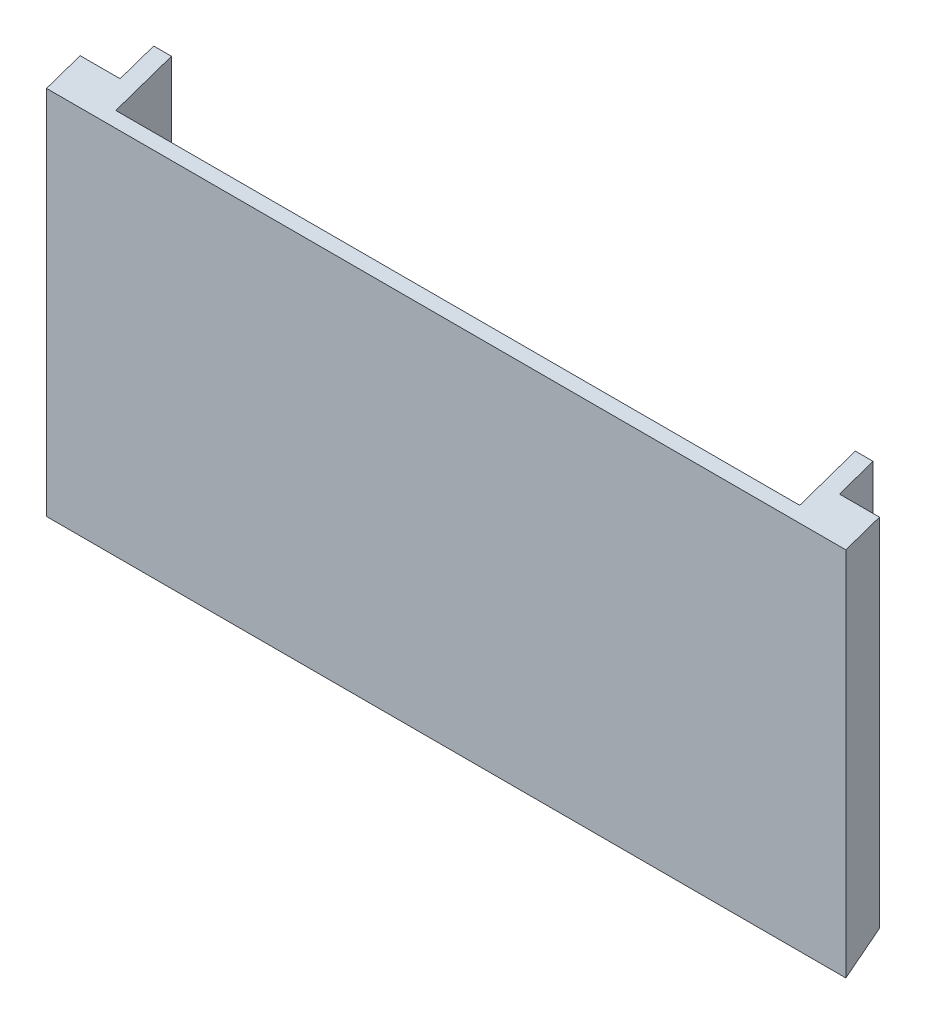
ISO-10303-21;
HEADER;
FILE_DESCRIPTION(('STEP AP214'),'2;1');
FILE_NAME('part.step','',(''),(''),'','','');
FILE_SCHEMA(('AUTOMOTIVE_DESIGN { 1 0 10303 214 1 1 1 1 }'));
ENDSEC;
DATA;
#1=APPLICATION_CONTEXT('core data for automotive mechanical design processes');
#2=APPLICATION_PROTOCOL_DEFINITION('international standard','automotive_design',2000,#1);
#3=PRODUCT_CONTEXT('',#1,'mechanical');
#4=PRODUCT('Part','Part','',(#3));
#5=PRODUCT_RELATED_PRODUCT_CATEGORY('part','',(#4));
#6=PRODUCT_DEFINITION_FORMATION('','',#4);
#7=PRODUCT_DEFINITION_CONTEXT('part definition',#1,'design');
#8=PRODUCT_DEFINITION('design','',#6,#7);
#9=PRODUCT_DEFINITION_SHAPE('','',#8);
#10=(LENGTH_UNIT() NAMED_UNIT(*) SI_UNIT(.MILLI.,.METRE.));
#11=(NAMED_UNIT(*) PLANE_ANGLE_UNIT() SI_UNIT($,.RADIAN.));
#12=(NAMED_UNIT(*) SI_UNIT($,.STERADIAN.) SOLID_ANGLE_UNIT());
#13=UNCERTAINTY_MEASURE_WITH_UNIT(LENGTH_MEASURE(1.E-05),#10,'distance_accuracy_value','');
#14=(GEOMETRIC_REPRESENTATION_CONTEXT(3) GLOBAL_UNCERTAINTY_ASSIGNED_CONTEXT((#13)) GLOBAL_UNIT_ASSIGNED_CONTEXT((#10,
#11,#12)) REPRESENTATION_CONTEXT('',''));
#15=CARTESIAN_POINT('',(0.,0.,0.));
#16=DIRECTION('',(0.,0.,1.));
#17=DIRECTION('',(1.,0.,0.));
#18=AXIS2_PLACEMENT_3D('',#15,#16,#17);
#19=CARTESIAN_POINT('',(39.1808763165733,-23.6571047674019,-8.));
#20=DIRECTION('',(-1.,0.,0.));
#21=DIRECTION('',(0.,0.,1.));
#22=AXIS2_PLACEMENT_3D('',#19,#20,#21);
#23=PLANE('',#22);
#24=DIRECTION('',(0.,-1.,0.));
#25=VECTOR('',#24,1.);
#26=CARTESIAN_POINT('',(39.1808763165733,-23.6571047674019,-8.));
#27=LINE('',#26,#25);
#28=CARTESIAN_POINT('',(39.1808763165733,-26.6571047674019,-8.));
#29=VERTEX_POINT('',#28);
#30=CARTESIAN_POINT('',(39.1808763165733,-36.7657297001133,-8.));
#31=VERTEX_POINT('',#30);
#32=EDGE_CURVE('E239',#29,#31,#27,.T.);
#33=ORIENTED_EDGE('',*,*,#32,.T.);
#34=CARTESIAN_POINT('',(39.1808763165733,-36.7657297001133,-5.));
#35=DIRECTION('',(-1.,0.,0.));
#36=DIRECTION('',(0.,0.,1.));
#37=AXIS2_PLACEMENT_3D('',#34,#35,#36);
#38=CIRCLE('',#37,3.);
#39=CARTESIAN_POINT('',(39.1808763165733,-39.7657297001133,-5.));
#40=VERTEX_POINT('',#39);
#41=EDGE_CURVE('E365',#31,#40,#38,.T.);
#42=ORIENTED_EDGE('',*,*,#41,.T.);
#43=DIRECTION('',(0.,0.,1.));
#44=VECTOR('',#43,1.);
#45=CARTESIAN_POINT('',(39.1808763165733,-39.7657297001133,-8.));
#46=LINE('',#45,#44);
#47=CARTESIAN_POINT('',(39.1808763165733,-39.7657297001133,0.));
#48=VERTEX_POINT('',#47);
#49=EDGE_CURVE('E262',#40,#48,#46,.T.);
#50=ORIENTED_EDGE('',*,*,#49,.T.);
#51=DIRECTION('',(0.,-1.,0.));
#52=VECTOR('',#51,1.);
#53=CARTESIAN_POINT('',(39.1808763165733,-23.6571047674019,0.));
#54=LINE('',#53,#52);
#55=CARTESIAN_POINT('',(39.1808763165733,-23.6571047674019,0.));
#56=VERTEX_POINT('',#55);
#57=EDGE_CURVE('E249',#56,#48,#54,.T.);
#58=ORIENTED_EDGE('',*,*,#57,.F.);
#59=DIRECTION('',(0.,0.,1.));
#60=VECTOR('',#59,1.);
#61=CARTESIAN_POINT('',(39.1808763165733,-23.6571047674019,-8.));
#62=LINE('',#61,#60);
#63=CARTESIAN_POINT('',(39.1808763165733,-23.6571047674019,-5.));
#64=VERTEX_POINT('',#63);
#65=EDGE_CURVE('E260',#64,#56,#62,.T.);
#66=ORIENTED_EDGE('',*,*,#65,.F.);
#67=CARTESIAN_POINT('',(39.1808763165733,-26.6571047674019,-5.));
#68=DIRECTION('',(-1.,0.,0.));
#69=DIRECTION('',(0.,0.,1.));
#70=AXIS2_PLACEMENT_3D('',#67,#68,#69);
#71=CIRCLE('',#70,3.);
#72=EDGE_CURVE('E363',#64,#29,#71,.T.);
#73=ORIENTED_EDGE('',*,*,#72,.T.);
#74=EDGE_LOOP('',(#33,#42,#50,#58,#66,#73));
#75=FACE_BOUND('',#74,.T.);
#76=DIRECTION('',(0.,-1.,0.));
#77=VECTOR('',#76,1.);
#78=CARTESIAN_POINT('',(39.1808763165733,-23.6571047674019,-5.9));
#79=LINE('',#78,#77);
#80=CARTESIAN_POINT('',(39.1808763165733,-26.6571047674019,-5.9));
#81=VERTEX_POINT('',#80);
#82=CARTESIAN_POINT('',(39.1808763165733,-36.7657297001133,-5.9));
#83=VERTEX_POINT('',#82);
#84=EDGE_CURVE('E236',#81,#83,#79,.T.);
#85=ORIENTED_EDGE('',*,*,#84,.F.);
#86=CARTESIAN_POINT('',(39.1808763165733,-26.6571047674019,-4.));
#87=DIRECTION('',(-1.,0.,0.));
#88=DIRECTION('',(0.,0.,1.));
#89=AXIS2_PLACEMENT_3D('',#86,#87,#88);
#90=CIRCLE('',#89,1.9);
#91=CARTESIAN_POINT('',(39.1808763165733,-26.6571047674019,-2.1));
#92=VERTEX_POINT('',#91);
#93=EDGE_CURVE('E229',#81,#92,#90,.F.);
#94=ORIENTED_EDGE('',*,*,#93,.T.);
#95=DIRECTION('',(0.,-1.,0.));
#96=VECTOR('',#95,1.);
#97=CARTESIAN_POINT('',(39.1808763165733,-23.6571047674019,-2.1));
#98=LINE('',#97,#96);
#99=CARTESIAN_POINT('',(39.1808763165733,-36.7657297001133,-2.1));
#100=VERTEX_POINT('',#99);
#101=EDGE_CURVE('E205',#92,#100,#98,.T.);
#102=ORIENTED_EDGE('',*,*,#101,.T.);
#103=CARTESIAN_POINT('',(39.1808763165733,-36.7657297001133,-4.));
#104=DIRECTION('',(-1.,0.,0.));
#105=DIRECTION('',(0.,0.,1.));
#106=AXIS2_PLACEMENT_3D('',#103,#104,#105);
#107=CIRCLE('',#106,1.9);
#108=EDGE_CURVE('E234',#83,#100,#107,.T.);
#109=ORIENTED_EDGE('',*,*,#108,.F.);
#110=EDGE_LOOP('',(#85,#94,#102,#109));
#111=FACE_BOUND('',#110,.T.);
#112=ADVANCED_FACE('F40',(#75,#111),#23,.T.);
#113=CARTESIAN_POINT('',(50.6808763165733,-23.6571047674019,-8.));
#114=DIRECTION('',(-1.,0.,0.));
#115=DIRECTION('',(0.,0.,1.));
#116=AXIS2_PLACEMENT_3D('',#113,#114,#115);
#117=PLANE('',#116);
#118=DIRECTION('',(0.,0.,1.));
#119=VECTOR('',#118,1.);
#120=CARTESIAN_POINT('',(50.6808763165733,-39.7657297001133,-8.));
#121=LINE('',#120,#119);
#122=CARTESIAN_POINT('',(50.6808763165733,-39.7657297001133,-5.));
#123=VERTEX_POINT('',#122);
#124=CARTESIAN_POINT('',(50.6808763165733,-39.7657297001133,0.));
#125=VERTEX_POINT('',#124);
#126=EDGE_CURVE('E246',#123,#125,#121,.T.);
#127=ORIENTED_EDGE('',*,*,#126,.F.);
#128=CARTESIAN_POINT('',(50.6808763165733,-36.7657297001133,-5.));
#129=DIRECTION('',(-1.,0.,0.));
#130=DIRECTION('',(0.,0.,1.));
#131=AXIS2_PLACEMENT_3D('',#128,#129,#130);
#132=CIRCLE('',#131,3.);
#133=CARTESIAN_POINT('',(50.6808763165733,-36.7657297001133,-8.));
#134=VERTEX_POINT('',#133);
#135=EDGE_CURVE('E369',#123,#134,#132,.F.);
#136=ORIENTED_EDGE('',*,*,#135,.T.);
#137=DIRECTION('',(0.,-1.,0.));
#138=VECTOR('',#137,1.);
#139=CARTESIAN_POINT('',(50.6808763165733,-23.6571047674019,-8.));
#140=LINE('',#139,#138);
#141=CARTESIAN_POINT('',(50.6808763165733,-26.6571047674019,-8.));
#142=VERTEX_POINT('',#141);
#143=EDGE_CURVE('E242',#142,#134,#140,.T.);
#144=ORIENTED_EDGE('',*,*,#143,.F.);
#145=CARTESIAN_POINT('',(50.6808763165733,-26.6571047674019,-5.));
#146=DIRECTION('',(-1.,0.,0.));
#147=DIRECTION('',(0.,0.,1.));
#148=AXIS2_PLACEMENT_3D('',#145,#146,#147);
#149=CIRCLE('',#148,3.);
#150=CARTESIAN_POINT('',(50.6808763165733,-23.6571047674019,-5.));
#151=VERTEX_POINT('',#150);
#152=EDGE_CURVE('E55',#142,#151,#149,.F.);
#153=ORIENTED_EDGE('',*,*,#152,.T.);
#154=DIRECTION('',(0.,0.,1.));
#155=VECTOR('',#154,1.);
#156=CARTESIAN_POINT('',(50.6808763165733,-23.6571047674019,-8.));
#157=LINE('',#156,#155);
#158=CARTESIAN_POINT('',(50.6808763165733,-23.6571047674019,0.));
#159=VERTEX_POINT('',#158);
#160=EDGE_CURVE('E258',#151,#159,#157,.T.);
#161=ORIENTED_EDGE('',*,*,#160,.T.);
#162=DIRECTION('',(0.,-1.,0.));
#163=VECTOR('',#162,1.);
#164=CARTESIAN_POINT('',(50.6808763165733,-23.6571047674019,0.));
#165=LINE('',#164,#163);
#166=EDGE_CURVE('E243',#159,#125,#165,.T.);
#167=ORIENTED_EDGE('',*,*,#166,.T.);
#168=EDGE_LOOP('',(#127,#136,#144,#153,#161,#167));
#169=FACE_BOUND('',#168,.T.);
#170=CARTESIAN_POINT('',(50.6808763165733,-26.6571047674019,-4.));
#171=DIRECTION('',(1.,0.,0.));
#172=DIRECTION('',(0.,0.,-1.));
#173=AXIS2_PLACEMENT_3D('',#170,#171,#172);
#174=CIRCLE('',#173,1.9);
#175=CARTESIAN_POINT('',(50.6808763165733,-26.6571047674019,-2.1));
#176=VERTEX_POINT('',#175);
#177=CARTESIAN_POINT('',(50.6808763165733,-26.6571047674019,-5.9));
#178=VERTEX_POINT('',#177);
#179=EDGE_CURVE('E213',#176,#178,#174,.F.);
#180=ORIENTED_EDGE('',*,*,#179,.T.);
#181=DIRECTION('',(0.,1.,0.));
#182=VECTOR('',#181,1.);
#183=CARTESIAN_POINT('',(50.6808763165733,0.,-5.9));
#184=LINE('',#183,#182);
#185=CARTESIAN_POINT('',(50.6808763165733,-36.7657297001133,-5.9));
#186=VERTEX_POINT('',#185);
#187=EDGE_CURVE('E218',#186,#178,#184,.T.);
#188=ORIENTED_EDGE('',*,*,#187,.F.);
#189=CARTESIAN_POINT('',(50.6808763165733,-36.7657297001133,-4.));
#190=DIRECTION('',(1.,0.,0.));
#191=DIRECTION('',(0.,0.,-1.));
#192=AXIS2_PLACEMENT_3D('',#189,#190,#191);
#193=CIRCLE('',#192,1.9);
#194=CARTESIAN_POINT('',(50.6808763165733,-36.7657297001133,-2.1));
#195=VERTEX_POINT('',#194);
#196=EDGE_CURVE('E222',#195,#186,#193,.T.);
#197=ORIENTED_EDGE('',*,*,#196,.F.);
#198=DIRECTION('',(0.,1.,0.));
#199=VECTOR('',#198,1.);
#200=CARTESIAN_POINT('',(50.6808763165733,0.,-2.09999999999999));
#201=LINE('',#200,#199);
#202=EDGE_CURVE('E202',#195,#176,#201,.T.);
#203=ORIENTED_EDGE('',*,*,#202,.T.);
#204=EDGE_LOOP('',(#180,#188,#197,#203));
#205=FACE_BOUND('',#204,.T.);
#206=ADVANCED_FACE('F220',(#169,#205),#117,.F.);
#207=CARTESIAN_POINT('',(0.,0.,0.));
#208=DIRECTION('',(0.,0.,1.));
#209=DIRECTION('',(1.,0.,0.));
#210=AXIS2_PLACEMENT_3D('',#207,#208,#209);
#211=PLANE('',#210);
#212=CARTESIAN_POINT('',(75.2338567398915,-15.8072520624966,0.));
#213=DIRECTION('',(0.,0.,1.));
#214=DIRECTION('',(1.,0.,0.));
#215=AXIS2_PLACEMENT_3D('',#212,#213,#214);
#216=CIRCLE('',#215,3.00000000000001);
#217=CARTESIAN_POINT('',(78.2338567398915,-15.8072520624966,0.));
#218=VERTEX_POINT('',#217);
#219=EDGE_CURVE('E11',#218,#218,#216,.F.);
#220=ORIENTED_EDGE('',*,*,#219,.F.);
#221=EDGE_LOOP('',(#220));
#222=FACE_BOUND('',#221,.T.);
#223=CARTESIAN_POINT('',(93.0738567398915,-15.8072520624966,0.));
#224=DIRECTION('',(0.,0.,1.));
#225=DIRECTION('',(1.,0.,0.));
#226=AXIS2_PLACEMENT_3D('',#223,#224,#225);
#227=CIRCLE('',#226,3.00000000000001);
#228=CARTESIAN_POINT('',(96.0738567398915,-15.8072520624966,0.));
#229=VERTEX_POINT('',#228);
#230=EDGE_CURVE('E48',#229,#229,#227,.F.);
#231=ORIENTED_EDGE('',*,*,#230,.F.);
#232=EDGE_LOOP('',(#231));
#233=FACE_BOUND('',#232,.T.);
#234=CARTESIAN_POINT('',(84.0638567398915,-47.6972520624967,0.));
#235=DIRECTION('',(0.,0.,1.));
#236=DIRECTION('',(1.,0.,0.));
#237=AXIS2_PLACEMENT_3D('',#234,#235,#236);
#238=CIRCLE('',#237,2.);
#239=CARTESIAN_POINT('',(86.0638567398915,-47.6972520624967,0.));
#240=VERTEX_POINT('',#239);
#241=EDGE_CURVE('E374',#240,#240,#238,.F.);
#242=ORIENTED_EDGE('',*,*,#241,.F.);
#243=EDGE_LOOP('',(#242));
#244=FACE_BOUND('',#243,.T.);
#245=DIRECTION('',(0.,1.,0.));
#246=VECTOR('',#245,1.);
#247=CARTESIAN_POINT('',(-12.533463782237,0.,0.));
#248=LINE('',#247,#246);
#249=CARTESIAN_POINT('',(-12.533463782237,-62.219139279103,0.));
#250=VERTEX_POINT('',#249);
#251=CARTESIAN_POINT('',(-12.533463782237,-7.06419972794608,0.));
#252=VERTEX_POINT('',#251);
#253=EDGE_CURVE('E305',#250,#252,#248,.T.);
#254=ORIENTED_EDGE('',*,*,#253,.T.);
#255=DIRECTION('',(1.,0.,0.));
#256=VECTOR('',#255,1.);
#257=CARTESIAN_POINT('',(0.,-7.06419972794608,0.));
#258=LINE('',#257,#256);
#259=CARTESIAN_POINT('',(102.966536217763,-7.06419972794608,0.));
#260=VERTEX_POINT('',#259);
#261=EDGE_CURVE('E351',#252,#260,#258,.T.);
#262=ORIENTED_EDGE('',*,*,#261,.T.);
#263=DIRECTION('',(0.,-1.,0.));
#264=VECTOR('',#263,1.);
#265=CARTESIAN_POINT('',(102.966536217763,0.,0.));
#266=LINE('',#265,#264);
#267=CARTESIAN_POINT('',(102.966536217763,-62.219139279103,0.));
#268=VERTEX_POINT('',#267);
#269=EDGE_CURVE('E308',#260,#268,#266,.T.);
#270=ORIENTED_EDGE('',*,*,#269,.T.);
#271=DIRECTION('',(1.,0.,0.));
#272=VECTOR('',#271,1.);
#273=CARTESIAN_POINT('',(0.,-62.219139279103,0.));
#274=LINE('',#273,#272);
#275=EDGE_CURVE('E269',#250,#268,#274,.T.);
#276=ORIENTED_EDGE('',*,*,#275,.F.);
#277=EDGE_LOOP('',(#254,#262,#270,#276));
#278=FACE_BOUND('',#277,.T.);
#279=DIRECTION('',(-1.,0.,0.));
#280=VECTOR('',#279,1.);
#281=CARTESIAN_POINT('',(50.6808763165733,-39.7657297001133,0.));
#282=LINE('',#281,#280);
#283=EDGE_CURVE('E238',#125,#48,#282,.T.);
#284=ORIENTED_EDGE('',*,*,#283,.F.);
#285=ORIENTED_EDGE('',*,*,#166,.F.);
#286=DIRECTION('',(-1.,0.,0.));
#287=VECTOR('',#286,1.);
#288=CARTESIAN_POINT('',(50.6808763165733,-23.6571047674019,0.));
#289=LINE('',#288,#287);
#290=EDGE_CURVE('E252',#159,#56,#289,.T.);
#291=ORIENTED_EDGE('',*,*,#290,.T.);
#292=ORIENTED_EDGE('',*,*,#57,.T.);
#293=EDGE_LOOP('',(#284,#285,#291,#292));
#294=FACE_BOUND('',#293,.T.);
#295=ADVANCED_FACE('F381',(#222,#233,#244,#278,#294),#211,.F.);
#296=DIRECTION('',(1.,0.,0.));
#297=VECTOR('',#296,1.);
#298=CARTESIAN_POINT('',(0.,-62.219139279103,0.));
#299=LINE('',#298,#297);
#300=CARTESIAN_POINT('',(-22.2834637822371,-62.219139279103,0.));
#301=VERTEX_POINT('',#300);
#302=CARTESIAN_POINT('',(-15.533463782237,-62.219139279103,0.));
#303=VERTEX_POINT('',#302);
#304=EDGE_CURVE('E272',#301,#303,#299,.T.);
#305=ORIENTED_EDGE('',*,*,#304,.F.);
#306=DIRECTION('',(0.,-1.,0.));
#307=VECTOR('',#306,1.);
#308=CARTESIAN_POINT('',(-22.2834637822371,-2.06419972794604,0.));
#309=LINE('',#308,#307);
#310=CARTESIAN_POINT('',(-22.2834637822371,-2.06419972794604,0.));
#311=VERTEX_POINT('',#310);
#312=EDGE_CURVE('E321',#311,#301,#309,.T.);
#313=ORIENTED_EDGE('',*,*,#312,.F.);
#314=DIRECTION('',(-1.,0.,0.));
#315=VECTOR('',#314,1.);
#316=CARTESIAN_POINT('',(-12.2834637822371,-2.06419972794605,0.));
#317=LINE('',#316,#315);
#318=CARTESIAN_POINT('',(-15.533463782237,-2.06419972794605,0.));
#319=VERTEX_POINT('',#318);
#320=EDGE_CURVE('E336',#319,#311,#317,.T.);
#321=ORIENTED_EDGE('',*,*,#320,.F.);
#322=DIRECTION('',(0.,1.,0.));
#323=VECTOR('',#322,1.);
#324=CARTESIAN_POINT('',(-15.533463782237,0.,0.));
#325=LINE('',#324,#323);
#326=EDGE_CURVE('E303',#303,#319,#325,.T.);
#327=ORIENTED_EDGE('',*,*,#326,.F.);
#328=EDGE_LOOP('',(#305,#313,#321,#327));
#329=FACE_BOUND('',#328,.T.);
#330=ADVANCED_FACE('F384',(#329),#211,.F.);
#331=CARTESIAN_POINT('',(105.966536217763,-62.219139279103,0.));
#332=VERTEX_POINT('',#331);
#333=CARTESIAN_POINT('',(112.716536217763,-62.219139279103,0.));
#334=VERTEX_POINT('',#333);
#335=EDGE_CURVE('E275',#332,#334,#299,.T.);
#336=ORIENTED_EDGE('',*,*,#335,.F.);
#337=DIRECTION('',(0.,-1.,0.));
#338=VECTOR('',#337,1.);
#339=CARTESIAN_POINT('',(105.966536217763,0.,0.));
#340=LINE('',#339,#338);
#341=CARTESIAN_POINT('',(105.966536217763,-2.06419972794605,0.));
#342=VERTEX_POINT('',#341);
#343=EDGE_CURVE('E290',#342,#332,#340,.T.);
#344=ORIENTED_EDGE('',*,*,#343,.F.);
#345=CARTESIAN_POINT('',(112.716536217763,-2.06419972794605,0.));
#346=VERTEX_POINT('',#345);
#347=EDGE_CURVE('E326',#346,#342,#317,.T.);
#348=ORIENTED_EDGE('',*,*,#347,.F.);
#349=DIRECTION('',(0.,1.,0.));
#350=VECTOR('',#349,1.);
#351=CARTESIAN_POINT('',(112.716536217763,-2.06419972794605,0.));
#352=LINE('',#351,#350);
#353=EDGE_CURVE('E334',#334,#346,#352,.T.);
#354=ORIENTED_EDGE('',*,*,#353,.F.);
#355=EDGE_LOOP('',(#336,#344,#348,#354));
#356=FACE_BOUND('',#355,.T.);
#357=ADVANCED_FACE('F387',(#356),#211,.F.);
#358=CARTESIAN_POINT('',(-22.2834637822371,-4.01457446258598,5.67415530228758));
#359=DIRECTION('',(1.,0.,0.));
#360=DIRECTION('',(0.,0.,-1.));
#361=AXIS2_PLACEMENT_3D('',#358,#359,#360);
#362=PLANE('',#361);
#363=DIRECTION('',(0.,0.614135228944487,-0.789200811308062));
#364=VECTOR('',#363,1.);
#365=CARTESIAN_POINT('',(-22.2834637822371,-43.0167115946314,-24.6762777861082));
#366=LINE('',#365,#364);
#367=CARTESIAN_POINT('',(-22.2834637822371,-66.6346170836192,5.67415530228758));
#368=VERTEX_POINT('',#367);
#369=EDGE_CURVE('E278',#368,#301,#366,.T.);
#370=ORIENTED_EDGE('',*,*,#369,.F.);
#371=DIRECTION('',(0.,-1.,0.));
#372=VECTOR('',#371,1.);
#373=CARTESIAN_POINT('',(-22.2834637822371,-4.01457446258598,5.67415530228758));
#374=LINE('',#373,#372);
#375=CARTESIAN_POINT('',(-22.2834637822371,-4.01457446258598,5.67415530228758));
#376=VERTEX_POINT('',#375);
#377=EDGE_CURVE('E325',#376,#368,#374,.T.);
#378=ORIENTED_EDGE('',*,*,#377,.F.);
#379=DIRECTION('',(0.,0.325062455773322,-0.945692550381263));
#380=VECTOR('',#379,1.);
#381=CARTESIAN_POINT('',(-22.2834637822371,-4.01457446258598,5.67415530228758));
#382=LINE('',#381,#380);
#383=EDGE_CURVE('E341',#376,#311,#382,.T.);
#384=ORIENTED_EDGE('',*,*,#383,.T.);
#385=ORIENTED_EDGE('',*,*,#312,.T.);
#386=EDGE_LOOP('',(#370,#378,#384,#385));
#387=FACE_BOUND('',#386,.T.);
#388=ADVANCED_FACE('F535',(#387),#362,.F.);
#389=CARTESIAN_POINT('',(112.716536217763,-4.01457446258598,5.67415530228758));
#390=DIRECTION('',(-1.,0.,0.));
#391=DIRECTION('',(0.,0.,1.));
#392=AXIS2_PLACEMENT_3D('',#389,#390,#391);
#393=PLANE('',#392);
#394=DIRECTION('',(0.,-0.614135228944487,0.789200811308062));
#395=VECTOR('',#394,1.);
#396=CARTESIAN_POINT('',(112.716536217763,-43.0167115946314,-24.6762777861082));
#397=LINE('',#396,#395);
#398=CARTESIAN_POINT('',(112.716536217763,-66.6346170836192,5.67415530228758));
#399=VERTEX_POINT('',#398);
#400=EDGE_CURVE('E285',#334,#399,#397,.T.);
#401=ORIENTED_EDGE('',*,*,#400,.F.);
#402=ORIENTED_EDGE('',*,*,#353,.T.);
#403=DIRECTION('',(0.,0.325062455773322,-0.945692550381263));
#404=VECTOR('',#403,1.);
#405=CARTESIAN_POINT('',(112.716536217763,-4.01457446258598,5.67415530228758));
#406=LINE('',#405,#404);
#407=CARTESIAN_POINT('',(112.716536217763,-4.01457446258598,5.67415530228758));
#408=VERTEX_POINT('',#407);
#409=EDGE_CURVE('E331',#408,#346,#406,.T.);
#410=ORIENTED_EDGE('',*,*,#409,.F.);
#411=DIRECTION('',(0.,1.,0.));
#412=VECTOR('',#411,1.);
#413=CARTESIAN_POINT('',(112.716536217763,-4.01457446258598,5.67415530228758));
#414=LINE('',#413,#412);
#415=EDGE_CURVE('E329',#399,#408,#414,.T.);
#416=ORIENTED_EDGE('',*,*,#415,.F.);
#417=EDGE_LOOP('',(#401,#402,#410,#416));
#418=FACE_BOUND('',#417,.T.);
#419=ADVANCED_FACE('F532',(#418),#393,.F.);
#420=CARTESIAN_POINT('',(0.,-1.95037473463993,5.67415530228758));
#421=DIRECTION('',(0.,0.,1.));
#422=DIRECTION('',(1.,0.,0.));
#423=AXIS2_PLACEMENT_3D('',#420,#421,#422);
#424=PLANE('',#423);
#425=ORIENTED_EDGE('',*,*,#377,.T.);
#426=DIRECTION('',(1.,0.,0.));
#427=VECTOR('',#426,1.);
#428=CARTESIAN_POINT('',(0.,-66.6346170836192,5.67415530228758));
#429=LINE('',#428,#427);
#430=EDGE_CURVE('E282',#368,#399,#429,.T.);
#431=ORIENTED_EDGE('',*,*,#430,.T.);
#432=ORIENTED_EDGE('',*,*,#415,.T.);
#433=DIRECTION('',(-1.,0.,0.));
#434=VECTOR('',#433,1.);
#435=CARTESIAN_POINT('',(-12.2834637822371,-4.01457446258598,5.67415530228758));
#436=LINE('',#435,#434);
#437=EDGE_CURVE('E322',#408,#376,#436,.T.);
#438=ORIENTED_EDGE('',*,*,#437,.T.);
#439=EDGE_LOOP('',(#425,#431,#432,#438));
#440=FACE_BOUND('',#439,.T.);
#441=ADVANCED_FACE('F525',(#440),#424,.T.);
#442=CARTESIAN_POINT('',(-15.533463782237,1.95037473463993,-5.67415530228758));
#443=DIRECTION('',(1.,0.,0.));
#444=DIRECTION('',(0.,0.,-1.));
#445=AXIS2_PLACEMENT_3D('',#442,#443,#444);
#446=PLANE('',#445);
#447=DIRECTION('',(0.,0.614135228944487,-0.789200811308062));
#448=VECTOR('',#447,1.);
#449=CARTESIAN_POINT('',(-15.533463782237,-35.2667049235376,-34.6355038070323));
#450=LINE('',#449,#448);
#451=CARTESIAN_POINT('',(-15.533463782237,-57.8036614745868,-5.67415530228758));
#452=VERTEX_POINT('',#451);
#453=EDGE_CURVE('E267',#303,#452,#450,.T.);
#454=ORIENTED_EDGE('',*,*,#453,.F.);
#455=ORIENTED_EDGE('',*,*,#326,.T.);
#456=DIRECTION('',(0.,-0.325062455773322,0.945692550381263));
#457=VECTOR('',#456,1.);
#458=CARTESIAN_POINT('',(-15.533463782237,-0.113824993306115,-5.67415530228758));
#459=LINE('',#458,#457);
#460=CARTESIAN_POINT('',(-15.533463782237,-0.113824993306115,-5.67415530228758));
#461=VERTEX_POINT('',#460);
#462=EDGE_CURVE('E318',#461,#319,#459,.T.);
#463=ORIENTED_EDGE('',*,*,#462,.F.);
#464=DIRECTION('',(0.,1.,0.));
#465=VECTOR('',#464,1.);
#466=CARTESIAN_POINT('',(-15.533463782237,1.95037473463993,-5.67415530228758));
#467=LINE('',#466,#465);
#468=EDGE_CURVE('E287',#452,#461,#467,.T.);
#469=ORIENTED_EDGE('',*,*,#468,.F.);
#470=EDGE_LOOP('',(#454,#455,#463,#469));
#471=FACE_BOUND('',#470,.T.);
#472=ADVANCED_FACE('F703',(#471),#446,.F.);
#473=CARTESIAN_POINT('',(-12.533463782237,1.95037473463993,-5.67415530228758));
#474=DIRECTION('',(1.,0.,0.));
#475=DIRECTION('',(0.,0.,-1.));
#476=AXIS2_PLACEMENT_3D('',#473,#474,#475);
#477=PLANE('',#476);
#478=ORIENTED_EDGE('',*,*,#253,.F.);
#479=DIRECTION('',(0.,0.614135228944487,-0.789200811308062));
#480=VECTOR('',#479,1.);
#481=CARTESIAN_POINT('',(-12.533463782237,-35.2667049235376,-34.6355038070323));
#482=LINE('',#481,#480);
#483=CARTESIAN_POINT('',(-12.533463782237,-57.8036614745867,-5.67415530228758));
#484=VERTEX_POINT('',#483);
#485=EDGE_CURVE('E264',#250,#484,#482,.T.);
#486=ORIENTED_EDGE('',*,*,#485,.T.);
#487=DIRECTION('',(0.,1.,0.));
#488=VECTOR('',#487,1.);
#489=CARTESIAN_POINT('',(-12.533463782237,1.95037473463993,-5.67415530228758));
#490=LINE('',#489,#488);
#491=CARTESIAN_POINT('',(-12.533463782237,-0.113824993306115,-5.67415530228758));
#492=VERTEX_POINT('',#491);
#493=EDGE_CURVE('E293',#484,#492,#490,.T.);
#494=ORIENTED_EDGE('',*,*,#493,.T.);
#495=DIRECTION('',(0.,-0.325062455773322,0.945692550381263));
#496=VECTOR('',#495,1.);
#497=CARTESIAN_POINT('',(-12.533463782237,-0.113824993306115,-5.67415530228758));
#498=LINE('',#497,#496);
#499=CARTESIAN_POINT('',(-12.533463782237,-3.34321281150253,3.72098691644353));
#500=VERTEX_POINT('',#499);
#501=EDGE_CURVE('E316',#492,#500,#498,.T.);
#502=ORIENTED_EDGE('',*,*,#501,.T.);
#503=DIRECTION('',(0.,0.70710678118655,0.707106781186545));
#504=VECTOR('',#503,1.);
#505=CARTESIAN_POINT('',(-12.533463782237,-3.34321281150253,3.72098691644353));
#506=LINE('',#505,#504);
#507=EDGE_CURVE('E353',#500,#252,#506,.F.);
#508=ORIENTED_EDGE('',*,*,#507,.T.);
#509=EDGE_LOOP('',(#478,#486,#494,#502,#508));
#510=FACE_BOUND('',#509,.T.);
#511=ADVANCED_FACE('F711',(#510),#477,.T.);
#512=CARTESIAN_POINT('',(102.966536217763,1.95037473463993,-5.67415530228758));
#513=DIRECTION('',(-1.,0.,0.));
#514=DIRECTION('',(0.,0.,1.));
#515=AXIS2_PLACEMENT_3D('',#512,#513,#514);
#516=PLANE('',#515);
#517=DIRECTION('',(0.,-1.,0.));
#518=VECTOR('',#517,1.);
#519=CARTESIAN_POINT('',(102.966536217763,1.95037473463993,-5.67415530228758));
#520=LINE('',#519,#518);
#521=CARTESIAN_POINT('',(102.966536217763,-0.113824993306115,-5.67415530228758));
#522=VERTEX_POINT('',#521);
#523=CARTESIAN_POINT('',(102.966536217763,-57.8036614745868,-5.67415530228758));
#524=VERTEX_POINT('',#523);
#525=EDGE_CURVE('E296',#522,#524,#520,.T.);
#526=ORIENTED_EDGE('',*,*,#525,.T.);
#527=DIRECTION('',(0.,-0.614135228944487,0.789200811308062));
#528=VECTOR('',#527,1.);
#529=CARTESIAN_POINT('',(102.966536217763,-35.2667049235377,-34.6355038070324));
#530=LINE('',#529,#528);
#531=EDGE_CURVE('E274',#524,#268,#530,.T.);
#532=ORIENTED_EDGE('',*,*,#531,.T.);
#533=ORIENTED_EDGE('',*,*,#269,.F.);
#534=DIRECTION('',(0.,-0.70710678118655,-0.707106781186545));
#535=VECTOR('',#534,1.);
#536=CARTESIAN_POINT('',(102.966536217763,-3.34321281150253,3.72098691644353));
#537=LINE('',#536,#535);
#538=CARTESIAN_POINT('',(102.966536217763,-3.34321281150253,3.72098691644353));
#539=VERTEX_POINT('',#538);
#540=EDGE_CURVE('E355',#260,#539,#537,.F.);
#541=ORIENTED_EDGE('',*,*,#540,.T.);
#542=DIRECTION('',(0.,-0.325062455773322,0.945692550381263));
#543=VECTOR('',#542,1.);
#544=CARTESIAN_POINT('',(102.966536217763,-0.113824993306115,-5.67415530228758));
#545=LINE('',#544,#543);
#546=EDGE_CURVE('E314',#522,#539,#545,.T.);
#547=ORIENTED_EDGE('',*,*,#546,.F.);
#548=EDGE_LOOP('',(#526,#532,#533,#541,#547));
#549=FACE_BOUND('',#548,.T.);
#550=ADVANCED_FACE('F719',(#549),#516,.T.);
#551=CARTESIAN_POINT('',(105.966536217763,1.95037473463991,-5.67415530228758));
#552=DIRECTION('',(-1.,0.,0.));
#553=DIRECTION('',(0.,-1.,0.));
#554=AXIS2_PLACEMENT_3D('',#551,#552,#553);
#555=PLANE('',#554);
#556=DIRECTION('',(0.,-0.614135228944487,0.789200811308062));
#557=VECTOR('',#556,1.);
#558=CARTESIAN_POINT('',(105.966536217763,-35.2667049235377,-34.6355038070323));
#559=LINE('',#558,#557);
#560=CARTESIAN_POINT('',(105.966536217763,-57.8036614745868,-5.67415530228758));
#561=VERTEX_POINT('',#560);
#562=EDGE_CURVE('E280',#561,#332,#559,.T.);
#563=ORIENTED_EDGE('',*,*,#562,.F.);
#564=DIRECTION('',(0.,-1.,0.));
#565=VECTOR('',#564,1.);
#566=CARTESIAN_POINT('',(105.966536217763,1.95037473463991,-5.67415530228758));
#567=LINE('',#566,#565);
#568=CARTESIAN_POINT('',(105.966536217763,-0.113824993306115,-5.67415530228758));
#569=VERTEX_POINT('',#568);
#570=EDGE_CURVE('E299',#569,#561,#567,.T.);
#571=ORIENTED_EDGE('',*,*,#570,.F.);
#572=DIRECTION('',(0.,-0.325062455773322,0.945692550381263));
#573=VECTOR('',#572,1.);
#574=CARTESIAN_POINT('',(105.966536217763,-0.113824993306115,-5.67415530228758));
#575=LINE('',#574,#573);
#576=EDGE_CURVE('E302',#569,#342,#575,.T.);
#577=ORIENTED_EDGE('',*,*,#576,.T.);
#578=ORIENTED_EDGE('',*,*,#343,.T.);
#579=EDGE_LOOP('',(#563,#571,#577,#578));
#580=FACE_BOUND('',#579,.T.);
#581=ADVANCED_FACE('F728',(#580),#555,.F.);
#582=CARTESIAN_POINT('',(0.,1.95037473463993,-5.67415530228758));
#583=DIRECTION('',(0.,0.,-1.));
#584=DIRECTION('',(-1.,0.,0.));
#585=AXIS2_PLACEMENT_3D('',#582,#583,#584);
#586=PLANE('',#585);
#587=ORIENTED_EDGE('',*,*,#570,.T.);
#588=DIRECTION('',(-1.,0.,0.));
#589=VECTOR('',#588,1.);
#590=CARTESIAN_POINT('',(0.,-57.8036614745867,-5.67415530228758));
#591=LINE('',#590,#589);
#592=EDGE_CURVE('E347',#561,#524,#591,.T.);
#593=ORIENTED_EDGE('',*,*,#592,.T.);
#594=ORIENTED_EDGE('',*,*,#525,.F.);
#595=DIRECTION('',(1.,0.,0.));
#596=VECTOR('',#595,1.);
#597=CARTESIAN_POINT('',(0.,-0.113824993306115,-5.67415530228758));
#598=LINE('',#597,#596);
#599=EDGE_CURVE('E294',#522,#569,#598,.T.);
#600=ORIENTED_EDGE('',*,*,#599,.T.);
#601=EDGE_LOOP('',(#587,#593,#594,#600));
#602=FACE_BOUND('',#601,.T.);
#603=ADVANCED_FACE('F736',(#602),#586,.T.);
#604=ORIENTED_EDGE('',*,*,#493,.F.);
#605=EDGE_CURVE('E344',#484,#452,#591,.T.);
#606=ORIENTED_EDGE('',*,*,#605,.T.);
#607=ORIENTED_EDGE('',*,*,#468,.T.);
#608=EDGE_CURVE('E289',#461,#492,#598,.T.);
#609=ORIENTED_EDGE('',*,*,#608,.T.);
#610=EDGE_LOOP('',(#604,#606,#607,#609));
#611=FACE_BOUND('',#610,.T.);
#612=ADVANCED_FACE('F530',(#611),#586,.T.);
#613=CARTESIAN_POINT('',(-12.2834637822371,-4.01457446258598,5.67415530228758));
#614=DIRECTION('',(0.,-0.945692550381263,-0.325062455773322));
#615=DIRECTION('',(0.,0.325062455773322,-0.945692550381263));
#616=AXIS2_PLACEMENT_3D('',#613,#614,#615);
#617=PLANE('',#616);
#618=DIRECTION('',(-1.,0.,0.));
#619=VECTOR('',#618,1.);
#620=CARTESIAN_POINT('',(-12.2834637822371,-3.34321281150253,3.72098691644353));
#621=LINE('',#620,#619);
#622=EDGE_CURVE('E348',#539,#500,#621,.T.);
#623=ORIENTED_EDGE('',*,*,#622,.T.);
#624=ORIENTED_EDGE('',*,*,#501,.F.);
#625=ORIENTED_EDGE('',*,*,#608,.F.);
#626=ORIENTED_EDGE('',*,*,#462,.T.);
#627=ORIENTED_EDGE('',*,*,#320,.T.);
#628=ORIENTED_EDGE('',*,*,#383,.F.);
#629=ORIENTED_EDGE('',*,*,#437,.F.);
#630=ORIENTED_EDGE('',*,*,#409,.T.);
#631=ORIENTED_EDGE('',*,*,#347,.T.);
#632=ORIENTED_EDGE('',*,*,#576,.F.);
#633=ORIENTED_EDGE('',*,*,#599,.F.);
#634=ORIENTED_EDGE('',*,*,#546,.T.);
#635=EDGE_LOOP('',(#623,#624,#625,#626,#627,#628,#629,#630,#631,#632,#633,#634));
#636=FACE_BOUND('',#635,.T.);
#637=ADVANCED_FACE('F527',(#636),#617,.F.);
#638=CARTESIAN_POINT('',(115.966536217763,45.5300269387125,-138.46417757701));
#639=DIRECTION('',(0.,-0.789200811308062,-0.614135228944487));
#640=DIRECTION('',(0.,0.614135228944487,-0.789200811308062));
#641=AXIS2_PLACEMENT_3D('',#638,#639,#640);
#642=PLANE('',#641);
#643=ORIENTED_EDGE('',*,*,#335,.T.);
#644=ORIENTED_EDGE('',*,*,#400,.T.);
#645=ORIENTED_EDGE('',*,*,#430,.F.);
#646=ORIENTED_EDGE('',*,*,#369,.T.);
#647=ORIENTED_EDGE('',*,*,#304,.T.);
#648=ORIENTED_EDGE('',*,*,#453,.T.);
#649=ORIENTED_EDGE('',*,*,#605,.F.);
#650=ORIENTED_EDGE('',*,*,#485,.F.);
#651=ORIENTED_EDGE('',*,*,#275,.T.);
#652=ORIENTED_EDGE('',*,*,#531,.F.);
#653=ORIENTED_EDGE('',*,*,#592,.F.);
#654=ORIENTED_EDGE('',*,*,#562,.T.);
#655=EDGE_LOOP('',(#643,#644,#645,#646,#647,#648,#649,#650,#651,#652,#653,#654));
#656=FACE_BOUND('',#655,.T.);
#657=ADVANCED_FACE('F423',(#656),#642,.T.);
#658=CARTESIAN_POINT('',(-12.2834637822371,-3.34321281150253,3.72098691644353));
#659=DIRECTION('',(0.,-0.707106781186545,0.70710678118655));
#660=DIRECTION('',(-1.,0.,0.));
#661=AXIS2_PLACEMENT_3D('',#658,#659,#660);
#662=PLANE('',#661);
#663=ORIENTED_EDGE('',*,*,#540,.F.);
#664=ORIENTED_EDGE('',*,*,#261,.F.);
#665=ORIENTED_EDGE('',*,*,#507,.F.);
#666=ORIENTED_EDGE('',*,*,#622,.F.);
#667=EDGE_LOOP('',(#663,#664,#665,#666));
#668=FACE_BOUND('',#667,.T.);
#669=ADVANCED_FACE('F416',(#668),#662,.F.);
#670=CARTESIAN_POINT('',(50.6808763165733,-39.7657297001133,-8.));
#671=DIRECTION('',(0.,1.,0.));
#672=DIRECTION('',(0.,0.,1.));
#673=AXIS2_PLACEMENT_3D('',#670,#671,#672);
#674=PLANE('',#673);
#675=ORIENTED_EDGE('',*,*,#49,.F.);
#676=DIRECTION('',(-1.,0.,0.));
#677=VECTOR('',#676,1.);
#678=CARTESIAN_POINT('',(50.6808763165733,-39.7657297001133,-5.));
#679=LINE('',#678,#677);
#680=EDGE_CURVE('E63',#40,#123,#679,.F.);
#681=ORIENTED_EDGE('',*,*,#680,.T.);
#682=ORIENTED_EDGE('',*,*,#126,.T.);
#683=ORIENTED_EDGE('',*,*,#283,.T.);
#684=EDGE_LOOP('',(#675,#681,#682,#683));
#685=FACE_BOUND('',#684,.T.);
#686=ADVANCED_FACE('F414',(#685),#674,.F.);
#687=CARTESIAN_POINT('',(50.6808763165733,-23.6571047674019,-8.));
#688=DIRECTION('',(0.,1.,0.));
#689=DIRECTION('',(0.,0.,1.));
#690=AXIS2_PLACEMENT_3D('',#687,#688,#689);
#691=PLANE('',#690);
#692=ORIENTED_EDGE('',*,*,#160,.F.);
#693=DIRECTION('',(-1.,0.,0.));
#694=VECTOR('',#693,1.);
#695=CARTESIAN_POINT('',(39.1808763165733,-23.6571047674019,-5.));
#696=LINE('',#695,#694);
#697=EDGE_CURVE('E371',#151,#64,#696,.T.);
#698=ORIENTED_EDGE('',*,*,#697,.T.);
#699=ORIENTED_EDGE('',*,*,#65,.T.);
#700=ORIENTED_EDGE('',*,*,#290,.F.);
#701=EDGE_LOOP('',(#692,#698,#699,#700));
#702=FACE_BOUND('',#701,.T.);
#703=ADVANCED_FACE('F402',(#702),#691,.T.);
#704=CARTESIAN_POINT('',(0.,0.,-8.));
#705=DIRECTION('',(0.,0.,1.));
#706=DIRECTION('',(1.,0.,0.));
#707=AXIS2_PLACEMENT_3D('',#704,#705,#706);
#708=PLANE('',#707);
#709=ORIENTED_EDGE('',*,*,#143,.T.);
#710=DIRECTION('',(-1.,0.,0.));
#711=VECTOR('',#710,1.);
#712=CARTESIAN_POINT('',(0.,-36.7657297001133,-8.));
#713=LINE('',#712,#711);
#714=EDGE_CURVE('E360',#134,#31,#713,.T.);
#715=ORIENTED_EDGE('',*,*,#714,.T.);
#716=ORIENTED_EDGE('',*,*,#32,.F.);
#717=DIRECTION('',(-1.,0.,0.));
#718=VECTOR('',#717,1.);
#719=CARTESIAN_POINT('',(50.6808763165733,-26.6571047674019,-8.));
#720=LINE('',#719,#718);
#721=EDGE_CURVE('E358',#29,#142,#720,.F.);
#722=ORIENTED_EDGE('',*,*,#721,.T.);
#723=EDGE_LOOP('',(#709,#715,#716,#722));
#724=FACE_BOUND('',#723,.T.);
#725=ADVANCED_FACE('F410',(#724),#708,.F.);
#726=CARTESIAN_POINT('',(35.8808763165733,0.,-5.9));
#727=DIRECTION('',(0.,0.,-1.));
#728=DIRECTION('',(0.,1.,0.));
#729=AXIS2_PLACEMENT_3D('',#726,#727,#728);
#730=PLANE('',#729);
#731=ORIENTED_EDGE('',*,*,#84,.T.);
#732=DIRECTION('',(1.,0.,0.));
#733=VECTOR('',#732,1.);
#734=CARTESIAN_POINT('',(35.8808763165733,-36.7657297001133,-5.9));
#735=LINE('',#734,#733);
#736=EDGE_CURVE('E227',#83,#186,#735,.T.);
#737=ORIENTED_EDGE('',*,*,#736,.T.);
#738=ORIENTED_EDGE('',*,*,#187,.T.);
#739=DIRECTION('',(1.,0.,0.));
#740=VECTOR('',#739,1.);
#741=CARTESIAN_POINT('',(35.8808763165733,-26.6571047674019,-5.9));
#742=LINE('',#741,#740);
#743=EDGE_CURVE('E209',#81,#178,#742,.T.);
#744=ORIENTED_EDGE('',*,*,#743,.F.);
#745=EDGE_LOOP('',(#731,#737,#738,#744));
#746=FACE_BOUND('',#745,.T.);
#747=ADVANCED_FACE('F436',(#746),#730,.F.);
#748=CARTESIAN_POINT('',(35.8808763165733,-36.7657297001133,-4.));
#749=DIRECTION('',(1.,0.,0.));
#750=DIRECTION('',(0.,0.,-1.));
#751=AXIS2_PLACEMENT_3D('',#748,#749,#750);
#752=CYLINDRICAL_SURFACE('',#751,1.9);
#753=ORIENTED_EDGE('',*,*,#108,.T.);
#754=DIRECTION('',(1.,0.,0.));
#755=VECTOR('',#754,1.);
#756=CARTESIAN_POINT('',(35.8808763165733,-36.7657297001133,-2.1));
#757=LINE('',#756,#755);
#758=EDGE_CURVE('E208',#100,#195,#757,.T.);
#759=ORIENTED_EDGE('',*,*,#758,.T.);
#760=ORIENTED_EDGE('',*,*,#196,.T.);
#761=ORIENTED_EDGE('',*,*,#736,.F.);
#762=EDGE_LOOP('',(#753,#759,#760,#761));
#763=FACE_BOUND('',#762,.T.);
#764=ADVANCED_FACE('F439',(#763),#752,.F.);
#765=CARTESIAN_POINT('',(35.8808763165733,0.,-2.09999999999999));
#766=DIRECTION('',(0.,0.,-1.));
#767=DIRECTION('',(0.,1.,0.));
#768=AXIS2_PLACEMENT_3D('',#765,#766,#767);
#769=PLANE('',#768);
#770=DIRECTION('',(1.,0.,0.));
#771=VECTOR('',#770,1.);
#772=CARTESIAN_POINT('',(35.8808763165733,-26.6571047674019,-2.1));
#773=LINE('',#772,#771);
#774=EDGE_CURVE('E197',#92,#176,#773,.T.);
#775=ORIENTED_EDGE('',*,*,#774,.T.);
#776=ORIENTED_EDGE('',*,*,#202,.F.);
#777=ORIENTED_EDGE('',*,*,#758,.F.);
#778=ORIENTED_EDGE('',*,*,#101,.F.);
#779=EDGE_LOOP('',(#775,#776,#777,#778));
#780=FACE_BOUND('',#779,.T.);
#781=ADVANCED_FACE('F199',(#780),#769,.T.);
#782=CARTESIAN_POINT('',(35.8808763165733,-26.6571047674019,-4.));
#783=DIRECTION('',(1.,0.,0.));
#784=DIRECTION('',(0.,0.,-1.));
#785=AXIS2_PLACEMENT_3D('',#782,#783,#784);
#786=CYLINDRICAL_SURFACE('',#785,1.9);
#787=ORIENTED_EDGE('',*,*,#743,.T.);
#788=ORIENTED_EDGE('',*,*,#179,.F.);
#789=ORIENTED_EDGE('',*,*,#774,.F.);
#790=ORIENTED_EDGE('',*,*,#93,.F.);
#791=EDGE_LOOP('',(#787,#788,#789,#790));
#792=FACE_BOUND('',#791,.T.);
#793=ADVANCED_FACE('F214',(#792),#786,.F.);
#794=CARTESIAN_POINT('',(0.,-36.7657297001133,-5.));
#795=DIRECTION('',(-1.,0.,0.));
#796=DIRECTION('',(0.,0.,1.));
#797=AXIS2_PLACEMENT_3D('',#794,#795,#796);
#798=CYLINDRICAL_SURFACE('',#797,3.);
#799=ORIENTED_EDGE('',*,*,#135,.F.);
#800=ORIENTED_EDGE('',*,*,#680,.F.);
#801=ORIENTED_EDGE('',*,*,#41,.F.);
#802=ORIENTED_EDGE('',*,*,#714,.F.);
#803=EDGE_LOOP('',(#799,#800,#801,#802));
#804=FACE_BOUND('',#803,.T.);
#805=ADVANCED_FACE('F413',(#804),#798,.T.);
#806=CARTESIAN_POINT('',(50.6808763165733,-26.6571047674019,-5.));
#807=DIRECTION('',(1.,0.,0.));
#808=DIRECTION('',(0.,0.,-1.));
#809=AXIS2_PLACEMENT_3D('',#806,#807,#808);
#810=CYLINDRICAL_SURFACE('',#809,3.);
#811=ORIENTED_EDGE('',*,*,#152,.F.);
#812=ORIENTED_EDGE('',*,*,#721,.F.);
#813=ORIENTED_EDGE('',*,*,#72,.F.);
#814=ORIENTED_EDGE('',*,*,#697,.F.);
#815=EDGE_LOOP('',(#811,#812,#813,#814));
#816=FACE_BOUND('',#815,.T.);
#817=ADVANCED_FACE('F42',(#816),#810,.T.);
#818=CARTESIAN_POINT('',(84.0638567398915,-47.6972520624967,-5.));
#819=DIRECTION('',(0.,0.,1.));
#820=DIRECTION('',(1.,0.,0.));
#821=AXIS2_PLACEMENT_3D('',#818,#819,#820);
#822=CYLINDRICAL_SURFACE('',#821,2.);
#823=CARTESIAN_POINT('',(84.0638567398915,-47.6972520624967,-5.));
#824=DIRECTION('',(0.,0.,-1.));
#825=DIRECTION('',(-1.,0.,0.));
#826=AXIS2_PLACEMENT_3D('',#823,#824,#825);
#827=CIRCLE('',#826,2.);
#828=CARTESIAN_POINT('',(82.0638567398915,-47.6972520624967,-5.));
#829=VERTEX_POINT('',#828);
#830=EDGE_CURVE('E505',#829,#829,#827,.T.);
#831=ORIENTED_EDGE('',*,*,#830,.F.);
#832=EDGE_LOOP('',(#831));
#833=FACE_BOUND('',#832,.T.);
#834=ORIENTED_EDGE('',*,*,#241,.T.);
#835=EDGE_LOOP('',(#834));
#836=FACE_BOUND('',#835,.T.);
#837=ADVANCED_FACE('F448',(#833,#836),#822,.T.);
#838=CARTESIAN_POINT('',(84.0638567398915,-47.6972520624967,-5.));
#839=DIRECTION('',(0.,0.,-1.));
#840=DIRECTION('',(-1.,0.,0.));
#841=AXIS2_PLACEMENT_3D('',#838,#839,#840);
#842=PLANE('',#841);
#843=ORIENTED_EDGE('',*,*,#830,.T.);
#844=EDGE_LOOP('',(#843));
#845=FACE_BOUND('',#844,.T.);
#846=ADVANCED_FACE('F451',(#845),#842,.T.);
#847=CARTESIAN_POINT('',(93.0738567398915,-15.8072520624966,-5.));
#848=DIRECTION('',(0.,0.,-1.));
#849=DIRECTION('',(-1.,0.,0.));
#850=AXIS2_PLACEMENT_3D('',#847,#848,#849);
#851=PLANE('',#850);
#852=CARTESIAN_POINT('',(93.0738567398915,-15.8072520624966,-5.));
#853=DIRECTION('',(0.,0.,-1.));
#854=DIRECTION('',(-1.,0.,0.));
#855=AXIS2_PLACEMENT_3D('',#852,#853,#854);
#856=CIRCLE('',#855,3.00000000000001);
#857=CARTESIAN_POINT('',(90.0738567398915,-15.8072520624966,-5.));
#858=VERTEX_POINT('',#857);
#859=EDGE_CURVE('E500',#858,#858,#856,.T.);
#860=ORIENTED_EDGE('',*,*,#859,.T.);
#861=EDGE_LOOP('',(#860));
#862=FACE_BOUND('',#861,.T.);
#863=CARTESIAN_POINT('',(93.0738567398915,-15.8072520624966,-5.));
#864=DIRECTION('',(0.,0.,-1.));
#865=DIRECTION('',(-1.,0.,0.));
#866=AXIS2_PLACEMENT_3D('',#863,#864,#865);
#867=CIRCLE('',#866,1.25);
#868=CARTESIAN_POINT('',(91.8238567398915,-15.8072520624966,-5.));
#869=VERTEX_POINT('',#868);
#870=EDGE_CURVE('E497',#869,#869,#867,.T.);
#871=ORIENTED_EDGE('',*,*,#870,.F.);
#872=EDGE_LOOP('',(#871));
#873=FACE_BOUND('',#872,.T.);
#874=ADVANCED_FACE('F455',(#862,#873),#851,.T.);
#875=CARTESIAN_POINT('',(93.0738567398915,-15.8072520624966,-5.));
#876=DIRECTION('',(0.,0.,1.));
#877=DIRECTION('',(1.,0.,0.));
#878=AXIS2_PLACEMENT_3D('',#875,#876,#877);
#879=CYLINDRICAL_SURFACE('',#878,3.00000000000001);
#880=ORIENTED_EDGE('',*,*,#859,.F.);
#881=EDGE_LOOP('',(#880));
#882=FACE_BOUND('',#881,.T.);
#883=ORIENTED_EDGE('',*,*,#230,.T.);
#884=EDGE_LOOP('',(#883));
#885=FACE_BOUND('',#884,.T.);
#886=ADVANCED_FACE('F379',(#882,#885),#879,.T.);
#887=CARTESIAN_POINT('',(93.0738567398915,-15.8072520624966,-5.));
#888=DIRECTION('',(0.,0.,1.));
#889=DIRECTION('',(1.,0.,0.));
#890=AXIS2_PLACEMENT_3D('',#887,#888,#889);
#891=CYLINDRICAL_SURFACE('',#890,1.25);
#892=ORIENTED_EDGE('',*,*,#870,.T.);
#893=EDGE_LOOP('',(#892));
#894=FACE_BOUND('',#893,.T.);
#895=CARTESIAN_POINT('',(93.0738567398915,-15.8072520624966,0.));
#896=DIRECTION('',(0.,0.,-1.));
#897=DIRECTION('',(-1.,0.,0.));
#898=AXIS2_PLACEMENT_3D('',#895,#896,#897);
#899=CIRCLE('',#898,1.25);
#900=CARTESIAN_POINT('',(91.8238567398915,-15.8072520624966,0.));
#901=VERTEX_POINT('',#900);
#902=EDGE_CURVE('E496',#901,#901,#899,.T.);
#903=ORIENTED_EDGE('',*,*,#902,.F.);
#904=EDGE_LOOP('',(#903));
#905=FACE_BOUND('',#904,.T.);
#906=ADVANCED_FACE('F459',(#894,#905),#891,.F.);
#907=ORIENTED_EDGE('',*,*,#902,.T.);
#908=EDGE_LOOP('',(#907));
#909=FACE_BOUND('',#908,.T.);
#910=ADVANCED_FACE('F388',(#909),#211,.F.);
#911=CARTESIAN_POINT('',(75.2338567398915,-15.8072520624966,-5.));
#912=DIRECTION('',(0.,0.,-1.));
#913=DIRECTION('',(-1.,0.,0.));
#914=AXIS2_PLACEMENT_3D('',#911,#912,#913);
#915=PLANE('',#914);
#916=CARTESIAN_POINT('',(75.2338567398915,-15.8072520624966,-5.));
#917=DIRECTION('',(0.,0.,-1.));
#918=DIRECTION('',(-1.,0.,0.));
#919=AXIS2_PLACEMENT_3D('',#916,#917,#918);
#920=CIRCLE('',#919,3.00000000000001);
#921=CARTESIAN_POINT('',(72.2338567398915,-15.8072520624966,-5.));
#922=VERTEX_POINT('',#921);
#923=EDGE_CURVE('E491',#922,#922,#920,.T.);
#924=ORIENTED_EDGE('',*,*,#923,.T.);
#925=EDGE_LOOP('',(#924));
#926=FACE_BOUND('',#925,.T.);
#927=CARTESIAN_POINT('',(75.2338567398915,-15.8072520624966,-5.));
#928=DIRECTION('',(0.,0.,-1.));
#929=DIRECTION('',(-1.,0.,0.));
#930=AXIS2_PLACEMENT_3D('',#927,#928,#929);
#931=CIRCLE('',#930,1.25);
#932=CARTESIAN_POINT('',(73.9838567398915,-15.8072520624966,-5.));
#933=VERTEX_POINT('',#932);
#934=EDGE_CURVE('E486',#933,#933,#931,.T.);
#935=ORIENTED_EDGE('',*,*,#934,.F.);
#936=EDGE_LOOP('',(#935));
#937=FACE_BOUND('',#936,.T.);
#938=ADVANCED_FACE('F471',(#926,#937),#915,.T.);
#939=CARTESIAN_POINT('',(75.2338567398915,-15.8072520624966,-5.));
#940=DIRECTION('',(0.,0.,1.));
#941=DIRECTION('',(1.,0.,0.));
#942=AXIS2_PLACEMENT_3D('',#939,#940,#941);
#943=CYLINDRICAL_SURFACE('',#942,3.00000000000001);
#944=ORIENTED_EDGE('',*,*,#923,.F.);
#945=EDGE_LOOP('',(#944));
#946=FACE_BOUND('',#945,.T.);
#947=ORIENTED_EDGE('',*,*,#219,.T.);
#948=EDGE_LOOP('',(#947));
#949=FACE_BOUND('',#948,.T.);
#950=ADVANCED_FACE('F467',(#946,#949),#943,.T.);
#951=CARTESIAN_POINT('',(75.2338567398915,-15.8072520624966,-5.));
#952=DIRECTION('',(0.,0.,1.));
#953=DIRECTION('',(1.,0.,0.));
#954=AXIS2_PLACEMENT_3D('',#951,#952,#953);
#955=CYLINDRICAL_SURFACE('',#954,1.25);
#956=ORIENTED_EDGE('',*,*,#934,.T.);
#957=EDGE_LOOP('',(#956));
#958=FACE_BOUND('',#957,.T.);
#959=CARTESIAN_POINT('',(75.2338567398915,-15.8072520624966,0.));
#960=DIRECTION('',(0.,0.,-1.));
#961=DIRECTION('',(-1.,0.,0.));
#962=AXIS2_PLACEMENT_3D('',#959,#960,#961);
#963=CIRCLE('',#962,1.25);
#964=CARTESIAN_POINT('',(73.9838567398915,-15.8072520624966,0.));
#965=VERTEX_POINT('',#964);
#966=EDGE_CURVE('E489',#965,#965,#963,.T.);
#967=ORIENTED_EDGE('',*,*,#966,.F.);
#968=EDGE_LOOP('',(#967));
#969=FACE_BOUND('',#968,.T.);
#970=ADVANCED_FACE('F470',(#958,#969),#955,.F.);
#971=ORIENTED_EDGE('',*,*,#966,.T.);
#972=EDGE_LOOP('',(#971));
#973=FACE_BOUND('',#972,.T.);
#974=ADVANCED_FACE('F477',(#973),#211,.F.);
#975=CLOSED_SHELL('',(#112,#206,#295,#330,#357,#388,#419,#441,#472,#511,#550,#581,#603,#612,
#637,#657,#669,#686,#703,#725,#747,#764,#781,#793,#805,#817,#837,#846,#874,#886,#906,#910,#938,
#950,#970,#974));
#976=MANIFOLD_SOLID_BREP('B2',#975);
#977=ADVANCED_BREP_SHAPE_REPRESENTATION('',(#18,#976),#14);
#978=SHAPE_DEFINITION_REPRESENTATION(#9,#977);
ENDSEC;
END-ISO-10303-21;
